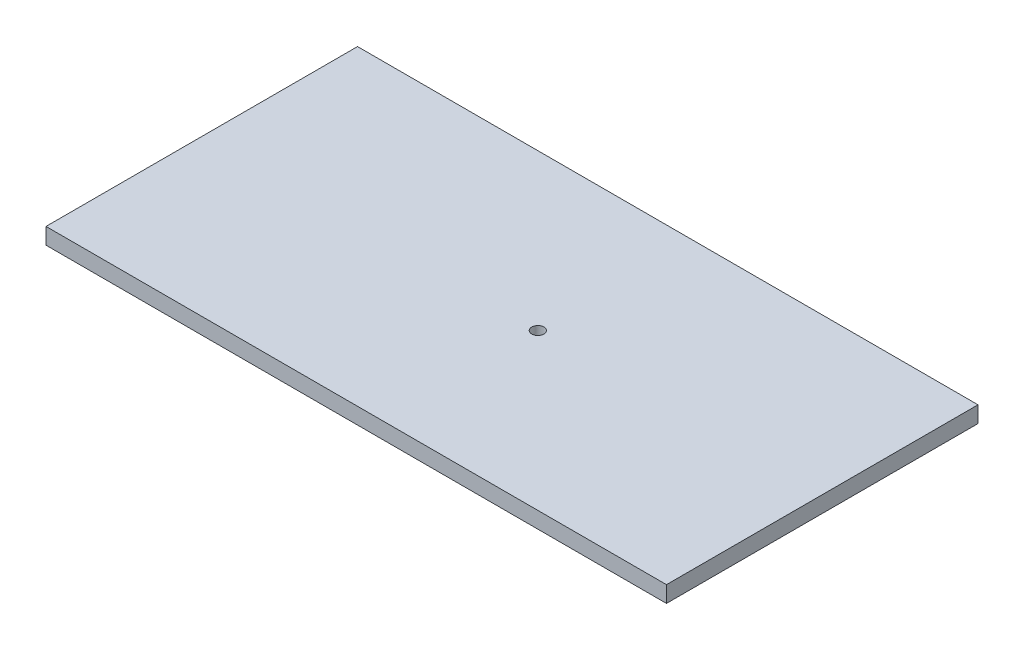
ISO-10303-21;
HEADER;
FILE_DESCRIPTION(('STEP AP214'),'2;1');
FILE_NAME('part.step','',(''),(''),'','','');
FILE_SCHEMA(('AUTOMOTIVE_DESIGN { 1 0 10303 214 1 1 1 1 }'));
ENDSEC;
DATA;
#1=APPLICATION_CONTEXT('core data for automotive mechanical design processes');
#2=APPLICATION_PROTOCOL_DEFINITION('international standard','automotive_design',2000,#1);
#3=PRODUCT_CONTEXT('',#1,'mechanical');
#4=PRODUCT('Part','Part','',(#3));
#5=PRODUCT_RELATED_PRODUCT_CATEGORY('part','',(#4));
#6=PRODUCT_DEFINITION_FORMATION('','',#4);
#7=PRODUCT_DEFINITION_CONTEXT('part definition',#1,'design');
#8=PRODUCT_DEFINITION('design','',#6,#7);
#9=PRODUCT_DEFINITION_SHAPE('','',#8);
#10=(LENGTH_UNIT() NAMED_UNIT(*) SI_UNIT(.MILLI.,.METRE.));
#11=(NAMED_UNIT(*) PLANE_ANGLE_UNIT() SI_UNIT($,.RADIAN.));
#12=(NAMED_UNIT(*) SI_UNIT($,.STERADIAN.) SOLID_ANGLE_UNIT());
#13=UNCERTAINTY_MEASURE_WITH_UNIT(LENGTH_MEASURE(1.E-05),#10,'distance_accuracy_value','');
#14=(GEOMETRIC_REPRESENTATION_CONTEXT(3) GLOBAL_UNCERTAINTY_ASSIGNED_CONTEXT((#13)) GLOBAL_UNIT_ASSIGNED_CONTEXT((#10,
#11,#12)) REPRESENTATION_CONTEXT('',''));
#15=CARTESIAN_POINT('',(0.,0.,0.));
#16=DIRECTION('',(0.,0.,1.));
#17=DIRECTION('',(1.,0.,0.));
#18=AXIS2_PLACEMENT_3D('',#15,#16,#17);
#19=CARTESIAN_POINT('',(0.,1.6,0.));
#20=DIRECTION('',(0.,1.,0.));
#21=DIRECTION('',(0.,0.,1.));
#22=AXIS2_PLACEMENT_3D('',#19,#20,#21);
#23=PLANE('',#22);
#24=DIRECTION('',(0.,0.,1.));
#25=VECTOR('',#24,1.);
#26=CARTESIAN_POINT('',(-30.48,1.6,-15.3035));
#27=LINE('',#26,#25);
#28=CARTESIAN_POINT('',(-30.48,1.6,-15.3035));
#29=VERTEX_POINT('',#28);
#30=CARTESIAN_POINT('',(-30.48,1.6,15.3035));
#31=VERTEX_POINT('',#30);
#32=EDGE_CURVE('E92',#29,#31,#27,.T.);
#33=ORIENTED_EDGE('',*,*,#32,.T.);
#34=DIRECTION('',(1.,0.,0.));
#35=VECTOR('',#34,1.);
#36=CARTESIAN_POINT('',(-30.48,1.6,15.3035));
#37=LINE('',#36,#35);
#38=CARTESIAN_POINT('',(30.48,1.6,15.3035));
#39=VERTEX_POINT('',#38);
#40=EDGE_CURVE('E87',#31,#39,#37,.T.);
#41=ORIENTED_EDGE('',*,*,#40,.T.);
#42=DIRECTION('',(0.,0.,-1.));
#43=VECTOR('',#42,1.);
#44=CARTESIAN_POINT('',(30.48,1.6,-15.3035));
#45=LINE('',#44,#43);
#46=CARTESIAN_POINT('',(30.48,1.6,-15.3035));
#47=VERTEX_POINT('',#46);
#48=EDGE_CURVE('E90',#39,#47,#45,.T.);
#49=ORIENTED_EDGE('',*,*,#48,.T.);
#50=DIRECTION('',(-1.,0.,0.));
#51=VECTOR('',#50,1.);
#52=CARTESIAN_POINT('',(-30.48,1.6,-15.3035));
#53=LINE('',#52,#51);
#54=EDGE_CURVE('E57',#47,#29,#53,.T.);
#55=ORIENTED_EDGE('',*,*,#54,.T.);
#56=EDGE_LOOP('',(#33,#41,#49,#55));
#57=FACE_BOUND('',#56,.T.);
#58=CARTESIAN_POINT('',(2.54,1.6,0.));
#59=DIRECTION('',(0.,1.,0.));
#60=DIRECTION('',(0.,0.,1.));
#61=AXIS2_PLACEMENT_3D('',#58,#59,#60);
#62=CIRCLE('',#61,0.6);
#63=CARTESIAN_POINT('',(2.54,1.6,0.600000000000001));
#64=VERTEX_POINT('',#63);
#65=EDGE_CURVE('E112',#64,#64,#62,.T.);
#66=ORIENTED_EDGE('',*,*,#65,.F.);
#67=EDGE_LOOP('',(#66));
#68=FACE_BOUND('',#67,.T.);
#69=ADVANCED_FACE('F39',(#57,#68),#23,.T.);
#70=CARTESIAN_POINT('',(0.,0.,0.));
#71=DIRECTION('',(0.,1.,0.));
#72=DIRECTION('',(0.,0.,1.));
#73=AXIS2_PLACEMENT_3D('',#70,#71,#72);
#74=PLANE('',#73);
#75=DIRECTION('',(0.,0.,1.));
#76=VECTOR('',#75,1.);
#77=CARTESIAN_POINT('',(-30.48,0.,-15.3035));
#78=LINE('',#77,#76);
#79=CARTESIAN_POINT('',(-30.48,0.,-15.3035));
#80=VERTEX_POINT('',#79);
#81=CARTESIAN_POINT('',(-30.48,0.,15.3035));
#82=VERTEX_POINT('',#81);
#83=EDGE_CURVE('E108',#80,#82,#78,.T.);
#84=ORIENTED_EDGE('',*,*,#83,.F.);
#85=DIRECTION('',(-1.,0.,0.));
#86=VECTOR('',#85,1.);
#87=CARTESIAN_POINT('',(-30.48,0.,-15.3035));
#88=LINE('',#87,#86);
#89=CARTESIAN_POINT('',(30.48,0.,-15.3035));
#90=VERTEX_POINT('',#89);
#91=EDGE_CURVE('E80',#90,#80,#88,.T.);
#92=ORIENTED_EDGE('',*,*,#91,.F.);
#93=DIRECTION('',(0.,0.,-1.));
#94=VECTOR('',#93,1.);
#95=CARTESIAN_POINT('',(30.48,0.,-15.3035));
#96=LINE('',#95,#94);
#97=CARTESIAN_POINT('',(30.48,0.,15.3035));
#98=VERTEX_POINT('',#97);
#99=EDGE_CURVE('E74',#98,#90,#96,.T.);
#100=ORIENTED_EDGE('',*,*,#99,.F.);
#101=DIRECTION('',(1.,0.,0.));
#102=VECTOR('',#101,1.);
#103=CARTESIAN_POINT('',(-30.48,0.,15.3035));
#104=LINE('',#103,#102);
#105=EDGE_CURVE('E97',#82,#98,#104,.T.);
#106=ORIENTED_EDGE('',*,*,#105,.F.);
#107=EDGE_LOOP('',(#84,#92,#100,#106));
#108=FACE_BOUND('',#107,.T.);
#109=CARTESIAN_POINT('',(2.54,0.,0.));
#110=DIRECTION('',(0.,1.,0.));
#111=DIRECTION('',(0.,0.,1.));
#112=AXIS2_PLACEMENT_3D('',#109,#110,#111);
#113=CIRCLE('',#112,0.6);
#114=CARTESIAN_POINT('',(2.54,0.,0.600000000000001));
#115=VERTEX_POINT('',#114);
#116=EDGE_CURVE('E130',#115,#115,#113,.T.);
#117=ORIENTED_EDGE('',*,*,#116,.T.);
#118=EDGE_LOOP('',(#117));
#119=FACE_BOUND('',#118,.T.);
#120=ADVANCED_FACE('F125',(#108,#119),#74,.F.);
#121=CARTESIAN_POINT('',(-30.48,1.6,-15.3035));
#122=DIRECTION('',(1.,0.,0.));
#123=DIRECTION('',(0.,0.,-1.));
#124=AXIS2_PLACEMENT_3D('',#121,#122,#123);
#125=PLANE('',#124);
#126=ORIENTED_EDGE('',*,*,#83,.T.);
#127=DIRECTION('',(0.,-1.,0.));
#128=VECTOR('',#127,1.);
#129=CARTESIAN_POINT('',(-30.48,1.6,15.3035));
#130=LINE('',#129,#128);
#131=EDGE_CURVE('E11',#31,#82,#130,.T.);
#132=ORIENTED_EDGE('',*,*,#131,.F.);
#133=ORIENTED_EDGE('',*,*,#32,.F.);
#134=DIRECTION('',(0.,-1.,0.));
#135=VECTOR('',#134,1.);
#136=CARTESIAN_POINT('',(-30.48,1.6,-15.3035));
#137=LINE('',#136,#135);
#138=EDGE_CURVE('E104',#29,#80,#137,.T.);
#139=ORIENTED_EDGE('',*,*,#138,.T.);
#140=EDGE_LOOP('',(#126,#132,#133,#139));
#141=FACE_BOUND('',#140,.T.);
#142=ADVANCED_FACE('F41',(#141),#125,.F.);
#143=CARTESIAN_POINT('',(-30.48,1.6,15.3035));
#144=DIRECTION('',(0.,0.,-1.));
#145=DIRECTION('',(-1.,0.,0.));
#146=AXIS2_PLACEMENT_3D('',#143,#144,#145);
#147=PLANE('',#146);
#148=ORIENTED_EDGE('',*,*,#105,.T.);
#149=DIRECTION('',(0.,-1.,0.));
#150=VECTOR('',#149,1.);
#151=CARTESIAN_POINT('',(30.48,1.6,15.3035));
#152=LINE('',#151,#150);
#153=EDGE_CURVE('E49',#39,#98,#152,.T.);
#154=ORIENTED_EDGE('',*,*,#153,.F.);
#155=ORIENTED_EDGE('',*,*,#40,.F.);
#156=ORIENTED_EDGE('',*,*,#131,.T.);
#157=EDGE_LOOP('',(#148,#154,#155,#156));
#158=FACE_BOUND('',#157,.T.);
#159=ADVANCED_FACE('F96',(#158),#147,.F.);
#160=CARTESIAN_POINT('',(30.48,1.6,-15.3035));
#161=DIRECTION('',(-1.,0.,0.));
#162=DIRECTION('',(0.,0.,1.));
#163=AXIS2_PLACEMENT_3D('',#160,#161,#162);
#164=PLANE('',#163);
#165=ORIENTED_EDGE('',*,*,#99,.T.);
#166=DIRECTION('',(0.,-1.,0.));
#167=VECTOR('',#166,1.);
#168=CARTESIAN_POINT('',(30.48,1.6,-15.3035));
#169=LINE('',#168,#167);
#170=EDGE_CURVE('E99',#47,#90,#169,.T.);
#171=ORIENTED_EDGE('',*,*,#170,.F.);
#172=ORIENTED_EDGE('',*,*,#48,.F.);
#173=ORIENTED_EDGE('',*,*,#153,.T.);
#174=EDGE_LOOP('',(#165,#171,#172,#173));
#175=FACE_BOUND('',#174,.T.);
#176=ADVANCED_FACE('F100',(#175),#164,.F.);
#177=CARTESIAN_POINT('',(-30.48,1.6,-15.3035));
#178=DIRECTION('',(0.,0.,1.));
#179=DIRECTION('',(1.,0.,0.));
#180=AXIS2_PLACEMENT_3D('',#177,#178,#179);
#181=PLANE('',#180);
#182=ORIENTED_EDGE('',*,*,#91,.T.);
#183=ORIENTED_EDGE('',*,*,#138,.F.);
#184=ORIENTED_EDGE('',*,*,#54,.F.);
#185=ORIENTED_EDGE('',*,*,#170,.T.);
#186=EDGE_LOOP('',(#182,#183,#184,#185));
#187=FACE_BOUND('',#186,.T.);
#188=ADVANCED_FACE('F122',(#187),#181,.F.);
#189=CARTESIAN_POINT('',(2.54,1.6,0.));
#190=DIRECTION('',(0.,-1.,0.));
#191=DIRECTION('',(0.,0.,-1.));
#192=AXIS2_PLACEMENT_3D('',#189,#190,#191);
#193=CYLINDRICAL_SURFACE('',#192,0.6);
#194=ORIENTED_EDGE('',*,*,#65,.T.);
#195=EDGE_LOOP('',(#194));
#196=FACE_BOUND('',#195,.T.);
#197=ORIENTED_EDGE('',*,*,#116,.F.);
#198=EDGE_LOOP('',(#197));
#199=FACE_BOUND('',#198,.T.);
#200=ADVANCED_FACE('F138',(#196,#199),#193,.F.);
#201=CLOSED_SHELL('',(#69,#120,#142,#159,#176,#188,#200));
#202=MANIFOLD_SOLID_BREP('B2',#201);
#203=ADVANCED_BREP_SHAPE_REPRESENTATION('',(#18,#202),#14);
#204=SHAPE_DEFINITION_REPRESENTATION(#9,#203);
ENDSEC;
END-ISO-10303-21;
